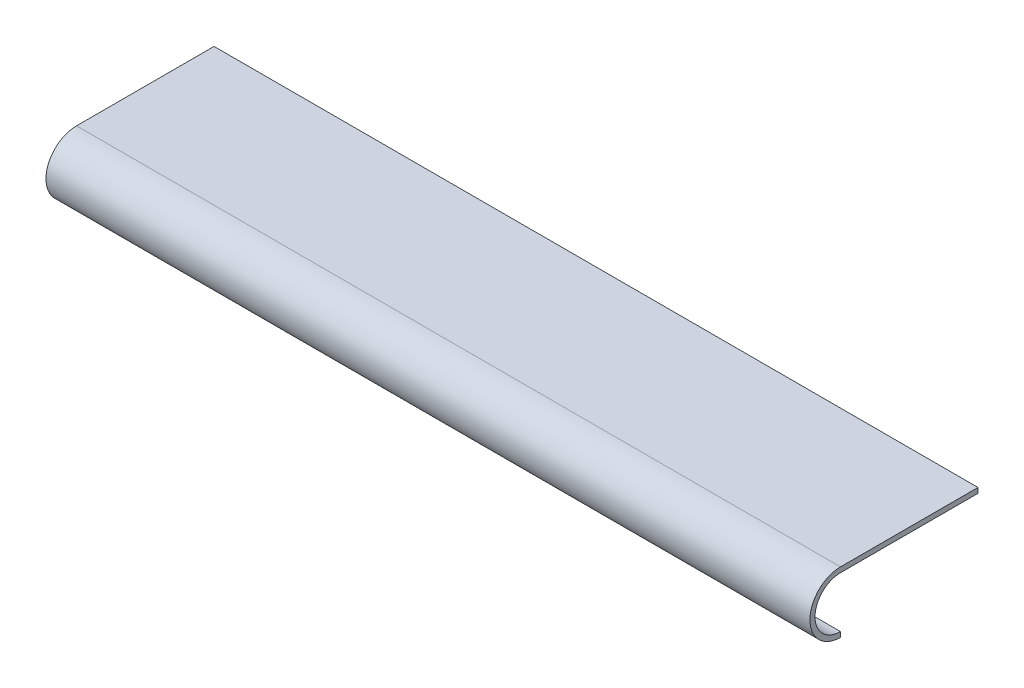
ISO-10303-21;
HEADER;
FILE_DESCRIPTION(('STEP AP214'),'2;1');
FILE_NAME('part.step','',(''),(''),'','','');
FILE_SCHEMA(('AUTOMOTIVE_DESIGN { 1 0 10303 214 1 1 1 1 }'));
ENDSEC;
DATA;
#1=APPLICATION_CONTEXT('core data for automotive mechanical design processes');
#2=APPLICATION_PROTOCOL_DEFINITION('international standard','automotive_design',2000,#1);
#3=PRODUCT_CONTEXT('',#1,'mechanical');
#4=PRODUCT('Part','Part','',(#3));
#5=PRODUCT_RELATED_PRODUCT_CATEGORY('part','',(#4));
#6=PRODUCT_DEFINITION_FORMATION('','',#4);
#7=PRODUCT_DEFINITION_CONTEXT('part definition',#1,'design');
#8=PRODUCT_DEFINITION('design','',#6,#7);
#9=PRODUCT_DEFINITION_SHAPE('','',#8);
#10=(LENGTH_UNIT() NAMED_UNIT(*) SI_UNIT(.MILLI.,.METRE.));
#11=(NAMED_UNIT(*) PLANE_ANGLE_UNIT() SI_UNIT($,.RADIAN.));
#12=(NAMED_UNIT(*) SI_UNIT($,.STERADIAN.) SOLID_ANGLE_UNIT());
#13=UNCERTAINTY_MEASURE_WITH_UNIT(LENGTH_MEASURE(1.E-05),#10,'distance_accuracy_value','');
#14=(GEOMETRIC_REPRESENTATION_CONTEXT(3) GLOBAL_UNCERTAINTY_ASSIGNED_CONTEXT((#13)) GLOBAL_UNIT_ASSIGNED_CONTEXT((#10,
#11,#12)) REPRESENTATION_CONTEXT('',''));
#15=CARTESIAN_POINT('',(0.,0.,0.));
#16=DIRECTION('',(0.,0.,1.));
#17=DIRECTION('',(1.,0.,0.));
#18=AXIS2_PLACEMENT_3D('',#15,#16,#17);
#19=CARTESIAN_POINT('',(0.,-0.6,2.7));
#20=DIRECTION('',(1.,0.,0.));
#21=DIRECTION('',(0.,0.,-1.));
#22=AXIS2_PLACEMENT_3D('',#19,#20,#21);
#23=CYLINDRICAL_SURFACE('',#22,0.499999999999999);
#24=CARTESIAN_POINT('',(0.,-0.6,2.7));
#25=DIRECTION('',(1.,0.,0.));
#26=DIRECTION('',(0.,0.,-1.));
#27=AXIS2_PLACEMENT_3D('',#24,#25,#26);
#28=CIRCLE('',#27,0.499999999999999);
#29=CARTESIAN_POINT('',(0.,-1.1,2.7));
#30=VERTEX_POINT('',#29);
#31=CARTESIAN_POINT('',(0.,-0.1,2.7));
#32=VERTEX_POINT('',#31);
#33=EDGE_CURVE('E75',#30,#32,#28,.F.);
#34=ORIENTED_EDGE('',*,*,#33,.F.);
#35=DIRECTION('',(1.,0.,0.));
#36=VECTOR('',#35,1.);
#37=CARTESIAN_POINT('',(0.,-1.1,2.7));
#38=LINE('',#37,#36);
#39=CARTESIAN_POINT('',(-15.,-1.1,2.7));
#40=VERTEX_POINT('',#39);
#41=EDGE_CURVE('E71',#30,#40,#38,.F.);
#42=ORIENTED_EDGE('',*,*,#41,.T.);
#43=CARTESIAN_POINT('',(-15.,-0.6,2.7));
#44=DIRECTION('',(1.,0.,0.));
#45=DIRECTION('',(0.,0.,-1.));
#46=AXIS2_PLACEMENT_3D('',#43,#44,#45);
#47=CIRCLE('',#46,0.499999999999999);
#48=CARTESIAN_POINT('',(-15.,-0.100000000000002,2.7));
#49=VERTEX_POINT('',#48);
#50=EDGE_CURVE('E20',#49,#40,#47,.T.);
#51=ORIENTED_EDGE('',*,*,#50,.F.);
#52=DIRECTION('',(-1.,0.,0.));
#53=VECTOR('',#52,1.);
#54=CARTESIAN_POINT('',(0.,-0.1,2.7));
#55=LINE('',#54,#53);
#56=EDGE_CURVE('E68',#49,#32,#55,.F.);
#57=ORIENTED_EDGE('',*,*,#56,.T.);
#58=EDGE_LOOP('',(#34,#42,#51,#57));
#59=FACE_BOUND('',#58,.T.);
#60=ADVANCED_FACE('F17',(#59),#23,.F.);
#61=CARTESIAN_POINT('',(0.,-1.1,2.7));
#62=DIRECTION('',(0.,0.,1.));
#63=DIRECTION('',(0.,-1.,0.));
#64=AXIS2_PLACEMENT_3D('',#61,#62,#63);
#65=PLANE('',#64);
#66=DIRECTION('',(1.,0.,0.));
#67=VECTOR('',#66,1.);
#68=CARTESIAN_POINT('',(0.,-1.2,2.7));
#69=LINE('',#68,#67);
#70=CARTESIAN_POINT('',(-15.,-1.2,2.7));
#71=VERTEX_POINT('',#70);
#72=CARTESIAN_POINT('',(0.,-1.2,2.7));
#73=VERTEX_POINT('',#72);
#74=EDGE_CURVE('E117',#71,#73,#69,.T.);
#75=ORIENTED_EDGE('',*,*,#74,.F.);
#76=DIRECTION('',(0.,-1.,0.));
#77=VECTOR('',#76,1.);
#78=CARTESIAN_POINT('',(-15.,-1.1,2.7));
#79=LINE('',#78,#77);
#80=EDGE_CURVE('E82',#40,#71,#79,.T.);
#81=ORIENTED_EDGE('',*,*,#80,.F.);
#82=ORIENTED_EDGE('',*,*,#41,.F.);
#83=DIRECTION('',(0.,-1.,0.));
#84=VECTOR('',#83,1.);
#85=CARTESIAN_POINT('',(0.,0.,2.7));
#86=LINE('',#85,#84);
#87=EDGE_CURVE('E114',#30,#73,#86,.T.);
#88=ORIENTED_EDGE('',*,*,#87,.T.);
#89=EDGE_LOOP('',(#75,#81,#82,#88));
#90=FACE_BOUND('',#89,.T.);
#91=ADVANCED_FACE('F136',(#90),#65,.F.);
#92=CARTESIAN_POINT('',(0.,-0.1,2.7));
#93=DIRECTION('',(0.,1.,0.));
#94=DIRECTION('',(-1.,0.,0.));
#95=AXIS2_PLACEMENT_3D('',#92,#93,#94);
#96=PLANE('',#95);
#97=DIRECTION('',(0.,0.,1.));
#98=VECTOR('',#97,1.);
#99=CARTESIAN_POINT('',(0.,-0.1,2.7));
#100=LINE('',#99,#98);
#101=CARTESIAN_POINT('',(0.,-0.1,0.));
#102=VERTEX_POINT('',#101);
#103=EDGE_CURVE('E81',#102,#32,#100,.T.);
#104=ORIENTED_EDGE('',*,*,#103,.T.);
#105=ORIENTED_EDGE('',*,*,#56,.F.);
#106=DIRECTION('',(0.,0.,-1.));
#107=VECTOR('',#106,1.);
#108=CARTESIAN_POINT('',(-15.,-0.100000000000002,2.7));
#109=LINE('',#108,#107);
#110=CARTESIAN_POINT('',(-15.,-0.100000000000001,0.));
#111=VERTEX_POINT('',#110);
#112=EDGE_CURVE('E80',#49,#111,#109,.T.);
#113=ORIENTED_EDGE('',*,*,#112,.T.);
#114=DIRECTION('',(-1.,0.,0.));
#115=VECTOR('',#114,1.);
#116=CARTESIAN_POINT('',(0.,-0.1,0.));
#117=LINE('',#116,#115);
#118=EDGE_CURVE('E90',#102,#111,#117,.T.);
#119=ORIENTED_EDGE('',*,*,#118,.F.);
#120=EDGE_LOOP('',(#104,#105,#113,#119));
#121=FACE_BOUND('',#120,.T.);
#122=ADVANCED_FACE('F78',(#121),#96,.F.);
#123=CARTESIAN_POINT('',(0.,0.,2.7));
#124=DIRECTION('',(-1.,0.,0.));
#125=DIRECTION('',(0.,-1.,0.));
#126=AXIS2_PLACEMENT_3D('',#123,#124,#125);
#127=PLANE('',#126);
#128=DIRECTION('',(0.,0.,-1.));
#129=VECTOR('',#128,1.);
#130=CARTESIAN_POINT('',(0.,0.,2.7));
#131=LINE('',#130,#129);
#132=CARTESIAN_POINT('',(0.,0.,0.));
#133=VERTEX_POINT('',#132);
#134=CARTESIAN_POINT('',(0.,0.,2.7));
#135=VERTEX_POINT('',#134);
#136=EDGE_CURVE('E101',#133,#135,#131,.F.);
#137=ORIENTED_EDGE('',*,*,#136,.T.);
#138=CARTESIAN_POINT('',(0.,-0.6,2.7));
#139=DIRECTION('',(1.,0.,0.));
#140=DIRECTION('',(0.,0.,-1.));
#141=AXIS2_PLACEMENT_3D('',#138,#139,#140);
#142=CIRCLE('',#141,0.599999999999999);
#143=EDGE_CURVE('E93',#73,#135,#142,.F.);
#144=ORIENTED_EDGE('',*,*,#143,.F.);
#145=ORIENTED_EDGE('',*,*,#87,.F.);
#146=ORIENTED_EDGE('',*,*,#33,.T.);
#147=ORIENTED_EDGE('',*,*,#103,.F.);
#148=DIRECTION('',(0.,1.,0.));
#149=VECTOR('',#148,1.);
#150=CARTESIAN_POINT('',(0.,-0.1,0.));
#151=LINE('',#150,#149);
#152=EDGE_CURVE('E86',#133,#102,#151,.F.);
#153=ORIENTED_EDGE('',*,*,#152,.F.);
#154=EDGE_LOOP('',(#137,#144,#145,#146,#147,#153));
#155=FACE_BOUND('',#154,.T.);
#156=ADVANCED_FACE('F131',(#155),#127,.F.);
#157=CARTESIAN_POINT('',(0.,-0.6,2.7));
#158=DIRECTION('',(1.,0.,0.));
#159=DIRECTION('',(0.,0.,-1.));
#160=AXIS2_PLACEMENT_3D('',#157,#158,#159);
#161=CYLINDRICAL_SURFACE('',#160,0.599999999999999);
#162=ORIENTED_EDGE('',*,*,#74,.T.);
#163=ORIENTED_EDGE('',*,*,#143,.T.);
#164=DIRECTION('',(1.,0.,0.));
#165=VECTOR('',#164,1.);
#166=CARTESIAN_POINT('',(0.,0.,2.7));
#167=LINE('',#166,#165);
#168=CARTESIAN_POINT('',(-15.,0.,2.7));
#169=VERTEX_POINT('',#168);
#170=EDGE_CURVE('E98',#135,#169,#167,.F.);
#171=ORIENTED_EDGE('',*,*,#170,.T.);
#172=CARTESIAN_POINT('',(-15.,-0.6,2.7));
#173=DIRECTION('',(1.,0.,0.));
#174=DIRECTION('',(0.,0.,-1.));
#175=AXIS2_PLACEMENT_3D('',#172,#173,#174);
#176=CIRCLE('',#175,0.599999999999999);
#177=EDGE_CURVE('E87',#169,#71,#176,.T.);
#178=ORIENTED_EDGE('',*,*,#177,.T.);
#179=EDGE_LOOP('',(#162,#163,#171,#178));
#180=FACE_BOUND('',#179,.T.);
#181=ADVANCED_FACE('F142',(#180),#161,.T.);
#182=CARTESIAN_POINT('',(-15.,0.,2.7));
#183=DIRECTION('',(1.,0.,0.));
#184=DIRECTION('',(0.,0.,-1.));
#185=AXIS2_PLACEMENT_3D('',#182,#183,#184);
#186=PLANE('',#185);
#187=ORIENTED_EDGE('',*,*,#112,.F.);
#188=ORIENTED_EDGE('',*,*,#50,.T.);
#189=ORIENTED_EDGE('',*,*,#80,.T.);
#190=ORIENTED_EDGE('',*,*,#177,.F.);
#191=DIRECTION('',(0.,0.,-1.));
#192=VECTOR('',#191,1.);
#193=CARTESIAN_POINT('',(-15.,0.,2.7));
#194=LINE('',#193,#192);
#195=CARTESIAN_POINT('',(-15.,0.,0.));
#196=VERTEX_POINT('',#195);
#197=EDGE_CURVE('E26',#169,#196,#194,.T.);
#198=ORIENTED_EDGE('',*,*,#197,.T.);
#199=DIRECTION('',(0.,1.,0.));
#200=VECTOR('',#199,1.);
#201=CARTESIAN_POINT('',(-15.,-0.1,0.));
#202=LINE('',#201,#200);
#203=EDGE_CURVE('E34',#111,#196,#202,.T.);
#204=ORIENTED_EDGE('',*,*,#203,.F.);
#205=EDGE_LOOP('',(#187,#188,#189,#190,#198,#204));
#206=FACE_BOUND('',#205,.T.);
#207=ADVANCED_FACE('F84',(#206),#186,.F.);
#208=CARTESIAN_POINT('',(0.,-0.1,0.));
#209=DIRECTION('',(0.,0.,-1.));
#210=DIRECTION('',(-1.,0.,0.));
#211=AXIS2_PLACEMENT_3D('',#208,#209,#210);
#212=PLANE('',#211);
#213=ORIENTED_EDGE('',*,*,#203,.T.);
#214=DIRECTION('',(1.,0.,0.));
#215=VECTOR('',#214,1.);
#216=CARTESIAN_POINT('',(0.,0.,0.));
#217=LINE('',#216,#215);
#218=EDGE_CURVE('E11',#196,#133,#217,.T.);
#219=ORIENTED_EDGE('',*,*,#218,.T.);
#220=ORIENTED_EDGE('',*,*,#152,.T.);
#221=ORIENTED_EDGE('',*,*,#118,.T.);
#222=EDGE_LOOP('',(#213,#219,#220,#221));
#223=FACE_BOUND('',#222,.T.);
#224=ADVANCED_FACE('F143',(#223),#212,.T.);
#225=CARTESIAN_POINT('',(0.,0.,2.7));
#226=DIRECTION('',(0.,-1.,0.));
#227=DIRECTION('',(0.,0.,-1.));
#228=AXIS2_PLACEMENT_3D('',#225,#226,#227);
#229=PLANE('',#228);
#230=ORIENTED_EDGE('',*,*,#197,.F.);
#231=ORIENTED_EDGE('',*,*,#170,.F.);
#232=ORIENTED_EDGE('',*,*,#136,.F.);
#233=ORIENTED_EDGE('',*,*,#218,.F.);
#234=EDGE_LOOP('',(#230,#231,#232,#233));
#235=FACE_BOUND('',#234,.T.);
#236=ADVANCED_FACE('F141',(#235),#229,.F.);
#237=CLOSED_SHELL('',(#60,#91,#122,#156,#181,#207,#224,#236));
#238=MANIFOLD_SOLID_BREP('B1',#237);
#239=ADVANCED_BREP_SHAPE_REPRESENTATION('',(#18,#238),#14);
#240=SHAPE_DEFINITION_REPRESENTATION(#9,#239);
ENDSEC;
END-ISO-10303-21;
